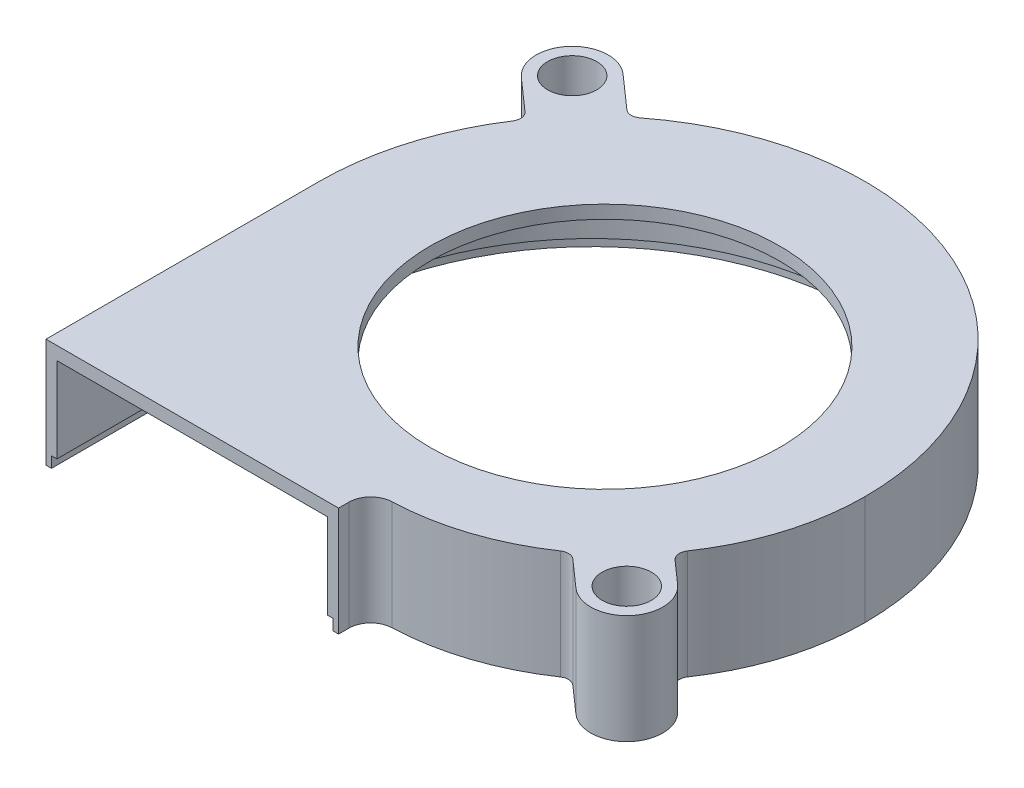
ISO-10303-21;
HEADER;
FILE_DESCRIPTION(('STEP AP214'),'2;1');
FILE_NAME('part.step','',(''),(''),'','','');
FILE_SCHEMA(('AUTOMOTIVE_DESIGN { 1 0 10303 214 1 1 1 1 }'));
ENDSEC;
DATA;
#1=APPLICATION_CONTEXT('core data for automotive mechanical design processes');
#2=APPLICATION_PROTOCOL_DEFINITION('international standard','automotive_design',2000,#1);
#3=PRODUCT_CONTEXT('',#1,'mechanical');
#4=PRODUCT('Part','Part','',(#3));
#5=PRODUCT_RELATED_PRODUCT_CATEGORY('part','',(#4));
#6=PRODUCT_DEFINITION_FORMATION('','',#4);
#7=PRODUCT_DEFINITION_CONTEXT('part definition',#1,'design');
#8=PRODUCT_DEFINITION('design','',#6,#7);
#9=PRODUCT_DEFINITION_SHAPE('','',#8);
#10=(LENGTH_UNIT() NAMED_UNIT(*) SI_UNIT(.MILLI.,.METRE.));
#11=(NAMED_UNIT(*) PLANE_ANGLE_UNIT() SI_UNIT($,.RADIAN.));
#12=(NAMED_UNIT(*) SI_UNIT($,.STERADIAN.) SOLID_ANGLE_UNIT());
#13=UNCERTAINTY_MEASURE_WITH_UNIT(LENGTH_MEASURE(1.E-05),#10,'distance_accuracy_value','');
#14=(GEOMETRIC_REPRESENTATION_CONTEXT(3) GLOBAL_UNCERTAINTY_ASSIGNED_CONTEXT((#13)) GLOBAL_UNIT_ASSIGNED_CONTEXT((#10,
#11,#12)) REPRESENTATION_CONTEXT('',''));
#15=CARTESIAN_POINT('',(0.,0.,0.));
#16=DIRECTION('',(0.,0.,1.));
#17=DIRECTION('',(1.,0.,0.));
#18=AXIS2_PLACEMENT_3D('',#15,#16,#17);
#19=CARTESIAN_POINT('',(-0.400000000000001,68.6136141093536,25.));
#20=DIRECTION('',(1.,0.,0.));
#21=DIRECTION('',(0.,0.,-1.));
#22=AXIS2_PLACEMENT_3D('',#19,#20,#21);
#23=PLANE('',#22);
#24=DIRECTION('',(0.,0.,-1.));
#25=VECTOR('',#24,1.);
#26=CARTESIAN_POINT('',(-0.400000000000001,-9.,24.0524077657047));
#27=LINE('',#26,#25);
#28=CARTESIAN_POINT('',(-0.400000000000001,-9.,25.));
#29=VERTEX_POINT('',#28);
#30=CARTESIAN_POINT('',(-0.400000000000001,-9.,24.0524077657047));
#31=VERTEX_POINT('',#30);
#32=EDGE_CURVE('E605',#29,#31,#27,.T.);
#33=ORIENTED_EDGE('',*,*,#32,.F.);
#34=DIRECTION('',(0.,-1.,0.));
#35=VECTOR('',#34,1.);
#36=CARTESIAN_POINT('',(-0.400000000000001,68.6136141093536,25.));
#37=LINE('',#36,#35);
#38=CARTESIAN_POINT('',(-0.400000000000001,-1.20000000000001,25.));
#39=VERTEX_POINT('',#38);
#40=EDGE_CURVE('E561',#39,#29,#37,.T.);
#41=ORIENTED_EDGE('',*,*,#40,.F.);
#42=DIRECTION('',(0.,0.,-1.));
#43=VECTOR('',#42,1.);
#44=CARTESIAN_POINT('',(-0.400000000000001,-1.20000000000001,25.));
#45=LINE('',#44,#43);
#46=CARTESIAN_POINT('',(-0.4,-1.20000000000001,24.0524077657047));
#47=VERTEX_POINT('',#46);
#48=EDGE_CURVE('E588',#39,#47,#45,.T.);
#49=ORIENTED_EDGE('',*,*,#48,.T.);
#50=DIRECTION('',(0.,-1.,0.));
#51=VECTOR('',#50,1.);
#52=CARTESIAN_POINT('',(-0.400000000000001,68.6136141093536,24.0524077657047));
#53=LINE('',#52,#51);
#54=EDGE_CURVE('E568',#47,#31,#53,.T.);
#55=ORIENTED_EDGE('',*,*,#54,.T.);
#56=EDGE_LOOP('',(#33,#41,#49,#55));
#57=FACE_BOUND('',#56,.T.);
#58=ADVANCED_FACE('F41',(#57),#23,.F.);
#59=CARTESIAN_POINT('',(2.6,68.6136141093536,24.0524077657047));
#60=DIRECTION('',(0.,-1.,0.));
#61=DIRECTION('',(0.,0.,-1.));
#62=AXIS2_PLACEMENT_3D('',#59,#60,#61);
#63=CYLINDRICAL_SURFACE('',#62,3.);
#64=CARTESIAN_POINT('',(2.6,-9.,24.0524077657047));
#65=DIRECTION('',(0.,-1.,0.));
#66=DIRECTION('',(0.,0.,-1.));
#67=AXIS2_PLACEMENT_3D('',#64,#65,#66);
#68=CIRCLE('',#67,3.);
#69=CARTESIAN_POINT('',(2.49179847072378,-9.,21.0543596625112));
#70=VERTEX_POINT('',#69);
#71=EDGE_CURVE('E624',#31,#70,#68,.T.);
#72=ORIENTED_EDGE('',*,*,#71,.F.);
#73=ORIENTED_EDGE('',*,*,#54,.F.);
#74=CARTESIAN_POINT('',(2.6,-1.20000000000001,24.0524077657047));
#75=DIRECTION('',(0.,-1.,0.));
#76=DIRECTION('',(0.,0.,-1.));
#77=AXIS2_PLACEMENT_3D('',#74,#75,#76);
#78=CIRCLE('',#77,3.);
#79=CARTESIAN_POINT('',(2.49179847072379,-1.20000000000001,21.0543596625112));
#80=VERTEX_POINT('',#79);
#81=EDGE_CURVE('E551',#47,#80,#78,.T.);
#82=ORIENTED_EDGE('',*,*,#81,.T.);
#83=DIRECTION('',(0.,-1.,0.));
#84=VECTOR('',#83,1.);
#85=CARTESIAN_POINT('',(2.49179847072379,68.6136141093536,21.0543596625112));
#86=LINE('',#85,#84);
#87=EDGE_CURVE('E547',#80,#70,#86,.T.);
#88=ORIENTED_EDGE('',*,*,#87,.T.);
#89=EDGE_LOOP('',(#72,#73,#82,#88));
#90=FACE_BOUND('',#89,.T.);
#91=ADVANCED_FACE('F350',(#90),#63,.T.);
#92=CARTESIAN_POINT('',(1.73193277310925,68.6136141093536,0.));
#93=DIRECTION('',(0.,-1.,0.));
#94=DIRECTION('',(0.,0.,-1.));
#95=AXIS2_PLACEMENT_3D('',#92,#93,#94);
#96=CYLINDRICAL_SURFACE('',#95,21.0680672268908);
#97=CARTESIAN_POINT('',(1.73193277310925,-9.,0.));
#98=DIRECTION('',(0.,1.,0.));
#99=DIRECTION('',(0.,0.,-1.));
#100=AXIS2_PLACEMENT_3D('',#97,#98,#99);
#101=CIRCLE('',#100,21.0680672268908);
#102=CARTESIAN_POINT('',(22.7999999921479,-9.,-0.000575200445968103));
#103=VERTEX_POINT('',#102);
#104=EDGE_CURVE('E677',#70,#103,#101,.T.);
#105=ORIENTED_EDGE('',*,*,#104,.F.);
#106=ORIENTED_EDGE('',*,*,#87,.F.);
#107=CARTESIAN_POINT('',(1.73193277310925,-1.20000000000001,0.));
#108=DIRECTION('',(0.,-1.,0.));
#109=DIRECTION('',(0.,0.,-1.));
#110=AXIS2_PLACEMENT_3D('',#107,#108,#109);
#111=CIRCLE('',#110,21.0680672268908);
#112=CARTESIAN_POINT('',(22.7999999921479,-1.20000000000001,-0.000575200445980473));
#113=VERTEX_POINT('',#112);
#114=EDGE_CURVE('E541',#80,#113,#111,.F.);
#115=ORIENTED_EDGE('',*,*,#114,.T.);
#116=DIRECTION('',(0.,-1.,0.));
#117=VECTOR('',#116,1.);
#118=CARTESIAN_POINT('',(22.7999999921479,68.6136141093536,-0.000575200445980471));
#119=LINE('',#118,#117);
#120=EDGE_CURVE('E545',#113,#103,#119,.T.);
#121=ORIENTED_EDGE('',*,*,#120,.T.);
#122=EDGE_LOOP('',(#105,#106,#115,#121));
#123=FACE_BOUND('',#122,.T.);
#124=ADVANCED_FACE('F356',(#123),#96,.F.);
#125=CARTESIAN_POINT('',(-1.2,68.6136141093536,-0.0288000000000007));
#126=DIRECTION('',(0.,-1.,0.));
#127=DIRECTION('',(0.,0.,-1.));
#128=AXIS2_PLACEMENT_3D('',#125,#126,#127);
#129=CYLINDRICAL_SURFACE('',#128,24.0000165887945);
#130=CARTESIAN_POINT('',(-1.2,-9.,-0.0288000000000007));
#131=DIRECTION('',(0.,1.,0.));
#132=DIRECTION('',(0.,0.,-1.));
#133=AXIS2_PLACEMENT_3D('',#130,#131,#132);
#134=CIRCLE('',#133,24.0000165887945);
#135=CARTESIAN_POINT('',(-25.2,-9.00000000000001,-0.000581877966769429));
#136=VERTEX_POINT('',#135);
#137=EDGE_CURVE('E59',#103,#136,#134,.T.);
#138=ORIENTED_EDGE('',*,*,#137,.F.);
#139=ORIENTED_EDGE('',*,*,#120,.F.);
#140=CARTESIAN_POINT('',(-1.2,-1.20000000000001,-0.0288000000000007));
#141=DIRECTION('',(0.,-1.,0.));
#142=DIRECTION('',(0.,0.,-1.));
#143=AXIS2_PLACEMENT_3D('',#140,#141,#142);
#144=CIRCLE('',#143,24.0000165887945);
#145=CARTESIAN_POINT('',(-25.2,-1.20000000000001,-0.000581877966769429));
#146=VERTEX_POINT('',#145);
#147=EDGE_CURVE('E552',#113,#146,#144,.F.);
#148=ORIENTED_EDGE('',*,*,#147,.T.);
#149=DIRECTION('',(0.,-1.,0.));
#150=VECTOR('',#149,1.);
#151=CARTESIAN_POINT('',(-25.2,68.6136141093536,-0.000581877966769429));
#152=LINE('',#151,#150);
#153=EDGE_CURVE('E564',#146,#136,#152,.T.);
#154=ORIENTED_EDGE('',*,*,#153,.T.);
#155=EDGE_LOOP('',(#138,#139,#148,#154));
#156=FACE_BOUND('',#155,.T.);
#157=ADVANCED_FACE('F366',(#156),#129,.F.);
#158=CARTESIAN_POINT('',(-25.2,68.6136141093536,-0.000581877966782148));
#159=DIRECTION('',(-1.,0.,0.));
#160=DIRECTION('',(0.,0.,1.));
#161=AXIS2_PLACEMENT_3D('',#158,#159,#160);
#162=PLANE('',#161);
#163=DIRECTION('',(0.,0.,1.));
#164=VECTOR('',#163,1.);
#165=CARTESIAN_POINT('',(-25.2,-9.,25.));
#166=LINE('',#165,#164);
#167=CARTESIAN_POINT('',(-25.2,-9.,25.));
#168=VERTEX_POINT('',#167);
#169=EDGE_CURVE('E672',#136,#168,#166,.T.);
#170=ORIENTED_EDGE('',*,*,#169,.F.);
#171=ORIENTED_EDGE('',*,*,#153,.F.);
#172=DIRECTION('',(0.,0.,1.));
#173=VECTOR('',#172,1.);
#174=CARTESIAN_POINT('',(-25.2,-1.20000000000001,-0.000581877966782148));
#175=LINE('',#174,#173);
#176=CARTESIAN_POINT('',(-25.2,-1.20000000000001,25.));
#177=VERTEX_POINT('',#176);
#178=EDGE_CURVE('E557',#146,#177,#175,.T.);
#179=ORIENTED_EDGE('',*,*,#178,.T.);
#180=DIRECTION('',(0.,-1.,0.));
#181=VECTOR('',#180,1.);
#182=CARTESIAN_POINT('',(-25.2,68.6136141093536,25.));
#183=LINE('',#182,#181);
#184=EDGE_CURVE('E570',#177,#168,#183,.T.);
#185=ORIENTED_EDGE('',*,*,#184,.T.);
#186=EDGE_LOOP('',(#170,#171,#179,#185));
#187=FACE_BOUND('',#186,.T.);
#188=ADVANCED_FACE('F370',(#187),#162,.F.);
#189=CARTESIAN_POINT('',(0.,-10.,0.));
#190=DIRECTION('',(0.,1.,0.));
#191=DIRECTION('',(0.,0.,1.));
#192=AXIS2_PLACEMENT_3D('',#189,#190,#191);
#193=CYLINDRICAL_SURFACE('',#192,16.);
#194=CARTESIAN_POINT('',(0.,0.,0.));
#195=DIRECTION('',(0.,1.,0.));
#196=DIRECTION('',(0.,0.,1.));
#197=AXIS2_PLACEMENT_3D('',#194,#195,#196);
#198=CIRCLE('',#197,16.);
#199=CARTESIAN_POINT('',(0.,0.,16.));
#200=VERTEX_POINT('',#199);
#201=EDGE_CURVE('E394',#200,#200,#198,.T.);
#202=ORIENTED_EDGE('',*,*,#201,.T.);
#203=EDGE_LOOP('',(#202));
#204=FACE_BOUND('',#203,.T.);
#205=CARTESIAN_POINT('',(0.,-1.2,0.));
#206=DIRECTION('',(0.,-1.,0.));
#207=DIRECTION('',(0.,0.,-1.));
#208=AXIS2_PLACEMENT_3D('',#205,#206,#207);
#209=CIRCLE('',#208,16.);
#210=CARTESIAN_POINT('',(0.,-1.2,-16.));
#211=VERTEX_POINT('',#210);
#212=EDGE_CURVE('E45',#211,#211,#209,.F.);
#213=ORIENTED_EDGE('',*,*,#212,.F.);
#214=EDGE_LOOP('',(#213));
#215=FACE_BOUND('',#214,.T.);
#216=ADVANCED_FACE('F347',(#204,#215),#193,.F.);
#217=CARTESIAN_POINT('',(-23.,-10.,-20.));
#218=DIRECTION('',(0.,1.,0.));
#219=DIRECTION('',(0.,0.,1.));
#220=AXIS2_PLACEMENT_3D('',#217,#218,#219);
#221=CYLINDRICAL_SURFACE('',#220,3.3);
#222=CARTESIAN_POINT('',(-23.,0.,-20.));
#223=DIRECTION('',(0.,1.,0.));
#224=DIRECTION('',(0.,0.,-1.));
#225=AXIS2_PLACEMENT_3D('',#222,#223,#224);
#226=CIRCLE('',#225,3.3);
#227=CARTESIAN_POINT('',(-20.8147472716434,0.,-22.4727859820878));
#228=VERTEX_POINT('',#227);
#229=CARTESIAN_POINT('',(-25.1852527283566,0.,-17.5272140179122));
#230=VERTEX_POINT('',#229);
#231=EDGE_CURVE('E221',#228,#230,#226,.T.);
#232=ORIENTED_EDGE('',*,*,#231,.F.);
#233=DIRECTION('',(0.,1.,0.));
#234=VECTOR('',#233,1.);
#235=CARTESIAN_POINT('',(-20.8147472716434,-10.,-22.4727859820878));
#236=LINE('',#235,#234);
#237=CARTESIAN_POINT('',(-20.8147472716434,-10.,-22.4727859820878));
#238=VERTEX_POINT('',#237);
#239=EDGE_CURVE('E12',#238,#228,#236,.T.);
#240=ORIENTED_EDGE('',*,*,#239,.F.);
#241=CARTESIAN_POINT('',(-23.,-10.,-20.));
#242=DIRECTION('',(0.,1.,0.));
#243=DIRECTION('',(0.,0.,-1.));
#244=AXIS2_PLACEMENT_3D('',#241,#242,#243);
#245=CIRCLE('',#244,3.3);
#246=CARTESIAN_POINT('',(-25.1852527283566,-10.,-17.5272140179122));
#247=VERTEX_POINT('',#246);
#248=EDGE_CURVE('E290',#238,#247,#245,.T.);
#249=ORIENTED_EDGE('',*,*,#248,.T.);
#250=DIRECTION('',(0.,1.,0.));
#251=VECTOR('',#250,1.);
#252=CARTESIAN_POINT('',(-25.1852527283566,-10.,-17.5272140179122));
#253=LINE('',#252,#251);
#254=EDGE_CURVE('E135',#247,#230,#253,.T.);
#255=ORIENTED_EDGE('',*,*,#254,.T.);
#256=EDGE_LOOP('',(#232,#240,#249,#255));
#257=FACE_BOUND('',#256,.T.);
#258=ADVANCED_FACE('F43',(#257),#221,.T.);
#259=CARTESIAN_POINT('',(-20.8147472716434,-10.,-22.4727859820878));
#260=DIRECTION('',(0.66219779647171,0.,-0.749329085481147));
#261=DIRECTION('',(-0.749329085481147,0.,-0.66219779647171));
#262=AXIS2_PLACEMENT_3D('',#259,#260,#261);
#263=PLANE('',#262);
#264=DIRECTION('',(-0.749329085481147,0.,-0.66219779647171));
#265=VECTOR('',#264,1.);
#266=CARTESIAN_POINT('',(-20.8147472716434,0.,-22.4727859820878));
#267=LINE('',#266,#265);
#268=CARTESIAN_POINT('',(-17.807958534947,0.,-19.8156238426817));
#269=VERTEX_POINT('',#268);
#270=EDGE_CURVE('E287',#269,#228,#267,.T.);
#271=ORIENTED_EDGE('',*,*,#270,.F.);
#272=DIRECTION('',(0.,1.,0.));
#273=VECTOR('',#272,1.);
#274=CARTESIAN_POINT('',(-17.807958534947,-10.,-19.8156238426817));
#275=LINE('',#274,#273);
#276=CARTESIAN_POINT('',(-17.807958534947,-10.,-19.8156238426817));
#277=VERTEX_POINT('',#276);
#278=EDGE_CURVE('E51',#277,#269,#275,.T.);
#279=ORIENTED_EDGE('',*,*,#278,.F.);
#280=DIRECTION('',(-0.749329085481147,0.,-0.66219779647171));
#281=VECTOR('',#280,1.);
#282=CARTESIAN_POINT('',(-20.8147472716434,-10.,-22.4727859820878));
#283=LINE('',#282,#281);
#284=EDGE_CURVE('E207',#277,#238,#283,.T.);
#285=ORIENTED_EDGE('',*,*,#284,.T.);
#286=ORIENTED_EDGE('',*,*,#239,.T.);
#287=EDGE_LOOP('',(#271,#279,#285,#286));
#288=FACE_BOUND('',#287,.T.);
#289=ADVANCED_FACE('F339',(#288),#263,.T.);
#290=CARTESIAN_POINT('',(-17.1457607384752,-10.,-20.5649529281628));
#291=DIRECTION('',(0.,1.,0.));
#292=DIRECTION('',(0.,0.,1.));
#293=AXIS2_PLACEMENT_3D('',#290,#291,#292);
#294=CYLINDRICAL_SURFACE('',#293,1.);
#295=CARTESIAN_POINT('',(-17.1457607384752,0.,-20.5649529281628));
#296=DIRECTION('',(0.,-1.,0.));
#297=DIRECTION('',(0.,0.,1.));
#298=AXIS2_PLACEMENT_3D('',#295,#296,#297);
#299=CIRCLE('',#298,1.);
#300=CARTESIAN_POINT('',(-16.5324626398368,0.,-19.7751013964137));
#301=VERTEX_POINT('',#300);
#302=EDGE_CURVE('E191',#301,#269,#299,.T.);
#303=ORIENTED_EDGE('',*,*,#302,.F.);
#304=DIRECTION('',(0.,1.,0.));
#305=VECTOR('',#304,1.);
#306=CARTESIAN_POINT('',(-16.5324626398368,-10.,-19.7751013964137));
#307=LINE('',#306,#305);
#308=CARTESIAN_POINT('',(-16.5324626398368,-10.,-19.7751013964137));
#309=VERTEX_POINT('',#308);
#310=EDGE_CURVE('E185',#309,#301,#307,.T.);
#311=ORIENTED_EDGE('',*,*,#310,.F.);
#312=CARTESIAN_POINT('',(-17.1457607384752,-10.,-20.5649529281628));
#313=DIRECTION('',(0.,-1.,0.));
#314=DIRECTION('',(0.,0.,1.));
#315=AXIS2_PLACEMENT_3D('',#312,#313,#314);
#316=CIRCLE('',#315,1.);
#317=EDGE_CURVE('E188',#309,#277,#316,.T.);
#318=ORIENTED_EDGE('',*,*,#317,.T.);
#319=ORIENTED_EDGE('',*,*,#278,.T.);
#320=EDGE_LOOP('',(#303,#311,#318,#319));
#321=FACE_BOUND('',#320,.T.);
#322=ADVANCED_FACE('F187',(#321),#294,.F.);
#323=CARTESIAN_POINT('',(-1.2,-10.,-0.0288000000000007));
#324=DIRECTION('',(0.,1.,0.));
#325=DIRECTION('',(0.,0.,1.));
#326=AXIS2_PLACEMENT_3D('',#323,#324,#325);
#327=CYLINDRICAL_SURFACE('',#326,25.0000165887945);
#328=CARTESIAN_POINT('',(-1.2,0.,-0.0288000000000007));
#329=DIRECTION('',(0.,1.,0.));
#330=DIRECTION('',(0.,0.,1.));
#331=AXIS2_PLACEMENT_3D('',#328,#329,#330);
#332=CIRCLE('',#331,25.0000165887945);
#333=CARTESIAN_POINT('',(23.8,0.,0.));
#334=VERTEX_POINT('',#333);
#335=EDGE_CURVE('E282',#334,#301,#332,.T.);
#336=ORIENTED_EDGE('',*,*,#335,.F.);
#337=DIRECTION('',(0.,1.,0.));
#338=VECTOR('',#337,1.);
#339=CARTESIAN_POINT('',(23.8,-10.,0.));
#340=LINE('',#339,#338);
#341=CARTESIAN_POINT('',(23.8,-10.,0.));
#342=VERTEX_POINT('',#341);
#343=EDGE_CURVE('E197',#342,#334,#340,.T.);
#344=ORIENTED_EDGE('',*,*,#343,.F.);
#345=CARTESIAN_POINT('',(-1.2,-10.,-0.0288000000000007));
#346=DIRECTION('',(0.,1.,0.));
#347=DIRECTION('',(0.,0.,1.));
#348=AXIS2_PLACEMENT_3D('',#345,#346,#347);
#349=CIRCLE('',#348,25.0000165887945);
#350=EDGE_CURVE('E205',#342,#309,#349,.T.);
#351=ORIENTED_EDGE('',*,*,#350,.T.);
#352=ORIENTED_EDGE('',*,*,#310,.T.);
#353=EDGE_LOOP('',(#336,#344,#351,#352));
#354=FACE_BOUND('',#353,.T.);
#355=ADVANCED_FACE('F210',(#354),#327,.T.);
#356=CARTESIAN_POINT('',(1.73193277310925,-10.,0.));
#357=DIRECTION('',(0.,1.,0.));
#358=DIRECTION('',(0.,0.,1.));
#359=AXIS2_PLACEMENT_3D('',#356,#357,#358);
#360=CYLINDRICAL_SURFACE('',#359,22.0680672268908);
#361=CARTESIAN_POINT('',(1.73193277310925,0.,0.));
#362=DIRECTION('',(0.,1.,0.));
#363=DIRECTION('',(0.,0.,-1.));
#364=AXIS2_PLACEMENT_3D('',#361,#362,#363);
#365=CIRCLE('',#364,22.0680672268908);
#366=CARTESIAN_POINT('',(19.9790752063348,0.,12.4113409489929));
#367=VERTEX_POINT('',#366);
#368=EDGE_CURVE('E278',#367,#334,#365,.T.);
#369=ORIENTED_EDGE('',*,*,#368,.F.);
#370=DIRECTION('',(0.,1.,0.));
#371=VECTOR('',#370,1.);
#372=CARTESIAN_POINT('',(19.9790752063348,-10.,12.4113409489929));
#373=LINE('',#372,#371);
#374=CARTESIAN_POINT('',(19.9790752063348,-10.,12.4113409489929));
#375=VERTEX_POINT('',#374);
#376=EDGE_CURVE('E296',#375,#367,#373,.T.);
#377=ORIENTED_EDGE('',*,*,#376,.F.);
#378=CARTESIAN_POINT('',(1.73193277310925,-10.,0.));
#379=DIRECTION('',(0.,1.,0.));
#380=DIRECTION('',(0.,0.,-1.));
#381=AXIS2_PLACEMENT_3D('',#378,#379,#380);
#382=CIRCLE('',#381,22.0680672268908);
#383=EDGE_CURVE('E212',#375,#342,#382,.T.);
#384=ORIENTED_EDGE('',*,*,#383,.T.);
#385=ORIENTED_EDGE('',*,*,#343,.T.);
#386=EDGE_LOOP('',(#369,#377,#384,#385));
#387=FACE_BOUND('',#386,.T.);
#388=ADVANCED_FACE('F743',(#387),#360,.T.);
#389=CARTESIAN_POINT('',(20.8059325040591,-10.,12.9737527280304));
#390=DIRECTION('',(0.,1.,0.));
#391=DIRECTION('',(0.,0.,1.));
#392=AXIS2_PLACEMENT_3D('',#389,#390,#391);
#393=CYLINDRICAL_SURFACE('',#392,1.);
#394=CARTESIAN_POINT('',(20.8059325040591,0.,12.9737527280304));
#395=DIRECTION('',(0.,-1.,0.));
#396=DIRECTION('',(0.,0.,-1.));
#397=AXIS2_PLACEMENT_3D('',#394,#395,#396);
#398=CIRCLE('',#397,1.);
#399=CARTESIAN_POINT('',(20.1437347075874,0.,13.7230818135115));
#400=VERTEX_POINT('',#399);
#401=EDGE_CURVE('E274',#400,#367,#398,.T.);
#402=ORIENTED_EDGE('',*,*,#401,.F.);
#403=DIRECTION('',(0.,1.,0.));
#404=VECTOR('',#403,1.);
#405=CARTESIAN_POINT('',(20.1437347075874,-10.,13.7230818135115));
#406=LINE('',#405,#404);
#407=CARTESIAN_POINT('',(20.1437347075874,-10.,13.7230818135115));
#408=VERTEX_POINT('',#407);
#409=EDGE_CURVE('E299',#408,#400,#406,.T.);
#410=ORIENTED_EDGE('',*,*,#409,.F.);
#411=CARTESIAN_POINT('',(20.8059325040591,-10.,12.9737527280304));
#412=DIRECTION('',(0.,-1.,0.));
#413=DIRECTION('',(0.,0.,-1.));
#414=AXIS2_PLACEMENT_3D('',#411,#412,#413);
#415=CIRCLE('',#414,1.);
#416=EDGE_CURVE('E215',#408,#375,#415,.T.);
#417=ORIENTED_EDGE('',*,*,#416,.T.);
#418=ORIENTED_EDGE('',*,*,#376,.T.);
#419=EDGE_LOOP('',(#402,#410,#417,#418));
#420=FACE_BOUND('',#419,.T.);
#421=ADVANCED_FACE('F468',(#420),#393,.F.);
#422=CARTESIAN_POINT('',(22.1852527283566,-10.,15.5272140179122));
#423=DIRECTION('',(0.66219779647171,0.,-0.749329085481147));
#424=DIRECTION('',(-0.749329085481147,0.,-0.66219779647171));
#425=AXIS2_PLACEMENT_3D('',#422,#423,#424);
#426=PLANE('',#425);
#427=DIRECTION('',(-0.749329085481146,0.,-0.66219779647171));
#428=VECTOR('',#427,1.);
#429=CARTESIAN_POINT('',(22.1852527283566,0.,15.5272140179122));
#430=LINE('',#429,#428);
#431=CARTESIAN_POINT('',(22.1852527283566,0.,15.5272140179122));
#432=VERTEX_POINT('',#431);
#433=EDGE_CURVE('E270',#432,#400,#430,.T.);
#434=ORIENTED_EDGE('',*,*,#433,.F.);
#435=DIRECTION('',(0.,1.,0.));
#436=VECTOR('',#435,1.);
#437=CARTESIAN_POINT('',(22.1852527283566,-10.,15.5272140179122));
#438=LINE('',#437,#436);
#439=CARTESIAN_POINT('',(22.1852527283566,-10.,15.5272140179122));
#440=VERTEX_POINT('',#439);
#441=EDGE_CURVE('E302',#440,#432,#438,.T.);
#442=ORIENTED_EDGE('',*,*,#441,.F.);
#443=DIRECTION('',(-0.749329085481146,0.,-0.66219779647171));
#444=VECTOR('',#443,1.);
#445=CARTESIAN_POINT('',(22.1852527283566,-10.,15.5272140179122));
#446=LINE('',#445,#444);
#447=EDGE_CURVE('E460',#440,#408,#446,.T.);
#448=ORIENTED_EDGE('',*,*,#447,.T.);
#449=ORIENTED_EDGE('',*,*,#409,.T.);
#450=EDGE_LOOP('',(#434,#442,#448,#449));
#451=FACE_BOUND('',#450,.T.);
#452=ADVANCED_FACE('F474',(#451),#426,.T.);
#453=CARTESIAN_POINT('',(20.,-10.,18.));
#454=DIRECTION('',(0.,1.,0.));
#455=DIRECTION('',(0.,0.,1.));
#456=AXIS2_PLACEMENT_3D('',#453,#454,#455);
#457=CYLINDRICAL_SURFACE('',#456,3.3);
#458=CARTESIAN_POINT('',(20.,0.,18.));
#459=DIRECTION('',(0.,1.,0.));
#460=DIRECTION('',(0.,0.,-1.));
#461=AXIS2_PLACEMENT_3D('',#458,#459,#460);
#462=CIRCLE('',#461,3.3);
#463=CARTESIAN_POINT('',(17.8147472716434,0.,20.4727859820878));
#464=VERTEX_POINT('',#463);
#465=EDGE_CURVE('E266',#464,#432,#462,.T.);
#466=ORIENTED_EDGE('',*,*,#465,.F.);
#467=DIRECTION('',(0.,1.,0.));
#468=VECTOR('',#467,1.);
#469=CARTESIAN_POINT('',(17.8147472716434,-10.,20.4727859820878));
#470=LINE('',#469,#468);
#471=CARTESIAN_POINT('',(17.8147472716434,-10.,20.4727859820878));
#472=VERTEX_POINT('',#471);
#473=EDGE_CURVE('E305',#472,#464,#470,.T.);
#474=ORIENTED_EDGE('',*,*,#473,.F.);
#475=CARTESIAN_POINT('',(20.,-10.,18.));
#476=DIRECTION('',(0.,1.,0.));
#477=DIRECTION('',(0.,0.,-1.));
#478=AXIS2_PLACEMENT_3D('',#475,#476,#477);
#479=CIRCLE('',#478,3.3);
#480=EDGE_CURVE('E456',#472,#440,#479,.T.);
#481=ORIENTED_EDGE('',*,*,#480,.T.);
#482=ORIENTED_EDGE('',*,*,#441,.T.);
#483=EDGE_LOOP('',(#466,#474,#481,#482));
#484=FACE_BOUND('',#483,.T.);
#485=ADVANCED_FACE('F477',(#484),#457,.T.);
#486=CARTESIAN_POINT('',(17.8147472716434,-10.,20.4727859820878));
#487=DIRECTION('',(-0.66219779647171,0.,0.749329085481146));
#488=DIRECTION('',(0.749329085481146,0.,0.66219779647171));
#489=AXIS2_PLACEMENT_3D('',#486,#487,#488);
#490=PLANE('',#489);
#491=DIRECTION('',(0.749329085481146,0.,0.66219779647171));
#492=VECTOR('',#491,1.);
#493=CARTESIAN_POINT('',(17.8147472716434,0.,20.4727859820878));
#494=LINE('',#493,#492);
#495=CARTESIAN_POINT('',(15.3769800356374,0.,18.3184800525942));
#496=VERTEX_POINT('',#495);
#497=EDGE_CURVE('E262',#496,#464,#494,.T.);
#498=ORIENTED_EDGE('',*,*,#497,.F.);
#499=DIRECTION('',(0.,1.,0.));
#500=VECTOR('',#499,1.);
#501=CARTESIAN_POINT('',(15.3769800356374,-10.,18.3184800525942));
#502=LINE('',#501,#500);
#503=CARTESIAN_POINT('',(15.3769800356374,-10.,18.3184800525942));
#504=VERTEX_POINT('',#503);
#505=EDGE_CURVE('E308',#504,#496,#502,.T.);
#506=ORIENTED_EDGE('',*,*,#505,.F.);
#507=DIRECTION('',(0.749329085481146,0.,0.66219779647171));
#508=VECTOR('',#507,1.);
#509=CARTESIAN_POINT('',(17.8147472716434,-10.,20.4727859820878));
#510=LINE('',#509,#508);
#511=EDGE_CURVE('E452',#504,#472,#510,.T.);
#512=ORIENTED_EDGE('',*,*,#511,.T.);
#513=ORIENTED_EDGE('',*,*,#473,.T.);
#514=EDGE_LOOP('',(#498,#506,#512,#513));
#515=FACE_BOUND('',#514,.T.);
#516=ADVANCED_FACE('F482',(#515),#490,.T.);
#517=CARTESIAN_POINT('',(14.7147822391657,-10.,19.0678091380753));
#518=DIRECTION('',(0.,1.,0.));
#519=DIRECTION('',(0.,0.,1.));
#520=AXIS2_PLACEMENT_3D('',#517,#518,#519);
#521=CYLINDRICAL_SURFACE('',#520,1.);
#522=CARTESIAN_POINT('',(14.7147822391657,0.,19.0678091380753));
#523=DIRECTION('',(0.,-1.,0.));
#524=DIRECTION('',(0.,0.,1.));
#525=AXIS2_PLACEMENT_3D('',#522,#523,#524);
#526=CIRCLE('',#525,1.);
#527=CARTESIAN_POINT('',(14.1519761168165,0.,18.2412202023604));
#528=VERTEX_POINT('',#527);
#529=EDGE_CURVE('E258',#528,#496,#526,.T.);
#530=ORIENTED_EDGE('',*,*,#529,.F.);
#531=DIRECTION('',(0.,1.,0.));
#532=VECTOR('',#531,1.);
#533=CARTESIAN_POINT('',(14.1519761168165,-10.,18.2412202023604));
#534=LINE('',#533,#532);
#535=CARTESIAN_POINT('',(14.1519761168165,-10.,18.2412202023604));
#536=VERTEX_POINT('',#535);
#537=EDGE_CURVE('E311',#536,#528,#534,.T.);
#538=ORIENTED_EDGE('',*,*,#537,.F.);
#539=CARTESIAN_POINT('',(14.7147822391657,-10.,19.0678091380753));
#540=DIRECTION('',(0.,-1.,0.));
#541=DIRECTION('',(0.,0.,1.));
#542=AXIS2_PLACEMENT_3D('',#539,#540,#541);
#543=CIRCLE('',#542,1.);
#544=EDGE_CURVE('E448',#536,#504,#543,.T.);
#545=ORIENTED_EDGE('',*,*,#544,.T.);
#546=ORIENTED_EDGE('',*,*,#505,.T.);
#547=EDGE_LOOP('',(#530,#538,#545,#546));
#548=FACE_BOUND('',#547,.T.);
#549=ADVANCED_FACE('F485',(#548),#521,.F.);
#550=CARTESIAN_POINT('',(1.73193277310925,-10.,0.));
#551=DIRECTION('',(0.,1.,0.));
#552=DIRECTION('',(0.,0.,1.));
#553=AXIS2_PLACEMENT_3D('',#550,#551,#552);
#554=CYLINDRICAL_SURFACE('',#553,22.0680672268908);
#555=CARTESIAN_POINT('',(1.73193277310925,0.,0.));
#556=DIRECTION('',(0.,1.,0.));
#557=DIRECTION('',(0.,0.,-1.));
#558=AXIS2_PLACEMENT_3D('',#555,#556,#557);
#559=CIRCLE('',#558,22.0680672268908);
#560=CARTESIAN_POINT('',(2.52786564714919,0.,22.0537090302423));
#561=VERTEX_POINT('',#560);
#562=EDGE_CURVE('E254',#561,#528,#559,.T.);
#563=ORIENTED_EDGE('',*,*,#562,.F.);
#564=DIRECTION('',(0.,1.,0.));
#565=VECTOR('',#564,1.);
#566=CARTESIAN_POINT('',(2.52786564714919,-10.,22.0537090302423));
#567=LINE('',#566,#565);
#568=CARTESIAN_POINT('',(2.52786564714919,-10.,22.0537090302423));
#569=VERTEX_POINT('',#568);
#570=EDGE_CURVE('E314',#569,#561,#567,.T.);
#571=ORIENTED_EDGE('',*,*,#570,.F.);
#572=CARTESIAN_POINT('',(1.73193277310925,-10.,0.));
#573=DIRECTION('',(0.,1.,0.));
#574=DIRECTION('',(0.,0.,-1.));
#575=AXIS2_PLACEMENT_3D('',#572,#573,#574);
#576=CIRCLE('',#575,22.0680672268908);
#577=EDGE_CURVE('E444',#569,#536,#576,.T.);
#578=ORIENTED_EDGE('',*,*,#577,.T.);
#579=ORIENTED_EDGE('',*,*,#537,.T.);
#580=EDGE_LOOP('',(#563,#571,#578,#579));
#581=FACE_BOUND('',#580,.T.);
#582=ADVANCED_FACE('F490',(#581),#554,.T.);
#583=CARTESIAN_POINT('',(2.6,-10.,24.0524077657047));
#584=DIRECTION('',(0.,1.,0.));
#585=DIRECTION('',(0.,0.,1.));
#586=AXIS2_PLACEMENT_3D('',#583,#584,#585);
#587=CYLINDRICAL_SURFACE('',#586,2.);
#588=CARTESIAN_POINT('',(2.6,0.,24.0524077657047));
#589=DIRECTION('',(0.,-1.,0.));
#590=DIRECTION('',(0.,0.,1.));
#591=AXIS2_PLACEMENT_3D('',#588,#589,#590);
#592=CIRCLE('',#591,2.);
#593=CARTESIAN_POINT('',(0.6,0.,24.0524077657047));
#594=VERTEX_POINT('',#593);
#595=EDGE_CURVE('E250',#594,#561,#592,.T.);
#596=ORIENTED_EDGE('',*,*,#595,.F.);
#597=DIRECTION('',(0.,1.,0.));
#598=VECTOR('',#597,1.);
#599=CARTESIAN_POINT('',(0.6,-10.,24.0524077657047));
#600=LINE('',#599,#598);
#601=CARTESIAN_POINT('',(0.6,-10.,24.0524077657047));
#602=VERTEX_POINT('',#601);
#603=EDGE_CURVE('E317',#602,#594,#600,.T.);
#604=ORIENTED_EDGE('',*,*,#603,.F.);
#605=CARTESIAN_POINT('',(2.6,-10.,24.0524077657047));
#606=DIRECTION('',(0.,-1.,0.));
#607=DIRECTION('',(0.,0.,1.));
#608=AXIS2_PLACEMENT_3D('',#605,#606,#607);
#609=CIRCLE('',#608,2.);
#610=EDGE_CURVE('E440',#602,#569,#609,.T.);
#611=ORIENTED_EDGE('',*,*,#610,.T.);
#612=ORIENTED_EDGE('',*,*,#570,.T.);
#613=EDGE_LOOP('',(#596,#604,#611,#612));
#614=FACE_BOUND('',#613,.T.);
#615=ADVANCED_FACE('F493',(#614),#587,.F.);
#616=CARTESIAN_POINT('',(0.6,-10.,25.));
#617=DIRECTION('',(1.,0.,0.));
#618=DIRECTION('',(0.,0.,-1.));
#619=AXIS2_PLACEMENT_3D('',#616,#617,#618);
#620=PLANE('',#619);
#621=DIRECTION('',(0.,0.,-1.));
#622=VECTOR('',#621,1.);
#623=CARTESIAN_POINT('',(0.6,0.,25.));
#624=LINE('',#623,#622);
#625=CARTESIAN_POINT('',(0.6,0.,25.));
#626=VERTEX_POINT('',#625);
#627=EDGE_CURVE('E246',#626,#594,#624,.T.);
#628=ORIENTED_EDGE('',*,*,#627,.F.);
#629=DIRECTION('',(0.,1.,0.));
#630=VECTOR('',#629,1.);
#631=CARTESIAN_POINT('',(0.6,-10.,25.));
#632=LINE('',#631,#630);
#633=CARTESIAN_POINT('',(0.6,-10.,25.));
#634=VERTEX_POINT('',#633);
#635=EDGE_CURVE('E320',#634,#626,#632,.T.);
#636=ORIENTED_EDGE('',*,*,#635,.F.);
#637=DIRECTION('',(0.,0.,-1.));
#638=VECTOR('',#637,1.);
#639=CARTESIAN_POINT('',(0.6,-10.,25.));
#640=LINE('',#639,#638);
#641=EDGE_CURVE('E436',#634,#602,#640,.T.);
#642=ORIENTED_EDGE('',*,*,#641,.T.);
#643=ORIENTED_EDGE('',*,*,#603,.T.);
#644=EDGE_LOOP('',(#628,#636,#642,#643));
#645=FACE_BOUND('',#644,.T.);
#646=ADVANCED_FACE('F499',(#645),#620,.T.);
#647=CARTESIAN_POINT('',(-26.2,-10.,25.));
#648=DIRECTION('',(0.,0.,1.));
#649=DIRECTION('',(1.,0.,0.));
#650=AXIS2_PLACEMENT_3D('',#647,#648,#649);
#651=PLANE('',#650);
#652=DIRECTION('',(0.,-1.,0.));
#653=VECTOR('',#652,1.);
#654=CARTESIAN_POINT('',(-25.7,-9.,25.));
#655=LINE('',#654,#653);
#656=CARTESIAN_POINT('',(-25.7,-9.,25.));
#657=VERTEX_POINT('',#656);
#658=CARTESIAN_POINT('',(-25.7,-10.,25.));
#659=VERTEX_POINT('',#658);
#660=EDGE_CURVE('E600',#657,#659,#655,.T.);
#661=ORIENTED_EDGE('',*,*,#660,.F.);
#662=DIRECTION('',(-1.,0.,0.));
#663=VECTOR('',#662,1.);
#664=CARTESIAN_POINT('',(-25.7,-9.,25.));
#665=LINE('',#664,#663);
#666=EDGE_CURVE('E668',#168,#657,#665,.T.);
#667=ORIENTED_EDGE('',*,*,#666,.F.);
#668=ORIENTED_EDGE('',*,*,#184,.F.);
#669=DIRECTION('',(1.,0.,0.));
#670=VECTOR('',#669,1.);
#671=CARTESIAN_POINT('',(-25.2,-1.20000000000001,25.));
#672=LINE('',#671,#670);
#673=EDGE_CURVE('E579',#177,#39,#672,.T.);
#674=ORIENTED_EDGE('',*,*,#673,.T.);
#675=ORIENTED_EDGE('',*,*,#40,.T.);
#676=DIRECTION('',(-1.,0.,0.));
#677=VECTOR('',#676,1.);
#678=CARTESIAN_POINT('',(-0.400000000000001,-9.,25.));
#679=LINE('',#678,#677);
#680=CARTESIAN_POINT('',(0.0999999999999994,-9.,25.));
#681=VERTEX_POINT('',#680);
#682=EDGE_CURVE('E644',#681,#29,#679,.T.);
#683=ORIENTED_EDGE('',*,*,#682,.F.);
#684=DIRECTION('',(0.,-1.,0.));
#685=VECTOR('',#684,1.);
#686=CARTESIAN_POINT('',(0.0999999999999994,-9.,25.));
#687=LINE('',#686,#685);
#688=CARTESIAN_POINT('',(0.0999999999999994,-10.,25.));
#689=VERTEX_POINT('',#688);
#690=EDGE_CURVE('E508',#681,#689,#687,.T.);
#691=ORIENTED_EDGE('',*,*,#690,.T.);
#692=DIRECTION('',(1.,0.,0.));
#693=VECTOR('',#692,1.);
#694=CARTESIAN_POINT('',(-26.2,-10.,25.));
#695=LINE('',#694,#693);
#696=EDGE_CURVE('E431',#689,#634,#695,.T.);
#697=ORIENTED_EDGE('',*,*,#696,.T.);
#698=ORIENTED_EDGE('',*,*,#635,.T.);
#699=DIRECTION('',(1.,0.,0.));
#700=VECTOR('',#699,1.);
#701=CARTESIAN_POINT('',(-26.2,0.,25.));
#702=LINE('',#701,#700);
#703=CARTESIAN_POINT('',(-26.2,0.,25.));
#704=VERTEX_POINT('',#703);
#705=EDGE_CURVE('E242',#704,#626,#702,.T.);
#706=ORIENTED_EDGE('',*,*,#705,.F.);
#707=DIRECTION('',(0.,1.,0.));
#708=VECTOR('',#707,1.);
#709=CARTESIAN_POINT('',(-26.2,-10.,25.));
#710=LINE('',#709,#708);
#711=CARTESIAN_POINT('',(-26.2,-10.,25.));
#712=VERTEX_POINT('',#711);
#713=EDGE_CURVE('E323',#712,#704,#710,.T.);
#714=ORIENTED_EDGE('',*,*,#713,.F.);
#715=EDGE_CURVE('E432',#712,#659,#695,.T.);
#716=ORIENTED_EDGE('',*,*,#715,.T.);
#717=EDGE_LOOP('',(#661,#667,#668,#674,#675,#683,#691,#697,#698,#706,#714,#716));
#718=FACE_BOUND('',#717,.T.);
#719=ADVANCED_FACE('F503',(#718),#651,.T.);
#720=CARTESIAN_POINT('',(-26.2,-10.,25.));
#721=DIRECTION('',(-1.,0.,0.));
#722=DIRECTION('',(0.,0.,1.));
#723=AXIS2_PLACEMENT_3D('',#720,#721,#722);
#724=PLANE('',#723);
#725=DIRECTION('',(0.,0.,1.));
#726=VECTOR('',#725,1.);
#727=CARTESIAN_POINT('',(-26.2,0.,25.));
#728=LINE('',#727,#726);
#729=CARTESIAN_POINT('',(-26.2,0.,0.));
#730=VERTEX_POINT('',#729);
#731=EDGE_CURVE('E238',#730,#704,#728,.T.);
#732=ORIENTED_EDGE('',*,*,#731,.F.);
#733=DIRECTION('',(0.,1.,0.));
#734=VECTOR('',#733,1.);
#735=CARTESIAN_POINT('',(-26.2,-10.,0.));
#736=LINE('',#735,#734);
#737=CARTESIAN_POINT('',(-26.2,-10.,0.));
#738=VERTEX_POINT('',#737);
#739=EDGE_CURVE('E326',#738,#730,#736,.T.);
#740=ORIENTED_EDGE('',*,*,#739,.F.);
#741=DIRECTION('',(0.,0.,1.));
#742=VECTOR('',#741,1.);
#743=CARTESIAN_POINT('',(-26.2,-10.,25.));
#744=LINE('',#743,#742);
#745=EDGE_CURVE('E427',#738,#712,#744,.T.);
#746=ORIENTED_EDGE('',*,*,#745,.T.);
#747=ORIENTED_EDGE('',*,*,#713,.T.);
#748=EDGE_LOOP('',(#732,#740,#746,#747));
#749=FACE_BOUND('',#748,.T.);
#750=ADVANCED_FACE('F735',(#749),#724,.T.);
#751=CARTESIAN_POINT('',(-1.2,-10.,-0.0288000000000007));
#752=DIRECTION('',(0.,1.,0.));
#753=DIRECTION('',(0.,0.,1.));
#754=AXIS2_PLACEMENT_3D('',#751,#752,#753);
#755=CYLINDRICAL_SURFACE('',#754,25.0000165887945);
#756=CARTESIAN_POINT('',(-1.2,0.,-0.0288000000000007));
#757=DIRECTION('',(0.,1.,0.));
#758=DIRECTION('',(0.,0.,1.));
#759=AXIS2_PLACEMENT_3D('',#756,#757,#758);
#760=CIRCLE('',#759,25.0000165887945);
#761=CARTESIAN_POINT('',(-22.1362113762564,0.,-13.6917382875249));
#762=VERTEX_POINT('',#761);
#763=EDGE_CURVE('E234',#762,#730,#760,.T.);
#764=ORIENTED_EDGE('',*,*,#763,.F.);
#765=DIRECTION('',(0.,1.,0.));
#766=VECTOR('',#765,1.);
#767=CARTESIAN_POINT('',(-22.1362113762564,-10.,-13.6917382875249));
#768=LINE('',#767,#766);
#769=CARTESIAN_POINT('',(-22.1362113762564,-10.,-13.6917382875249));
#770=VERTEX_POINT('',#769);
#771=EDGE_CURVE('E329',#770,#762,#768,.T.);
#772=ORIENTED_EDGE('',*,*,#771,.F.);
#773=CARTESIAN_POINT('',(-1.2,-10.,-0.0288000000000007));
#774=DIRECTION('',(0.,1.,0.));
#775=DIRECTION('',(0.,0.,1.));
#776=AXIS2_PLACEMENT_3D('',#773,#774,#775);
#777=CIRCLE('',#776,25.0000165887945);
#778=EDGE_CURVE('E423',#770,#738,#777,.T.);
#779=ORIENTED_EDGE('',*,*,#778,.T.);
#780=ORIENTED_EDGE('',*,*,#739,.T.);
#781=EDGE_LOOP('',(#764,#772,#779,#780));
#782=FACE_BOUND('',#781,.T.);
#783=ADVANCED_FACE('F738',(#782),#755,.T.);
#784=CARTESIAN_POINT('',(-22.9736592756166,-10.,-14.2382554563835));
#785=DIRECTION('',(0.,1.,0.));
#786=DIRECTION('',(0.,0.,1.));
#787=AXIS2_PLACEMENT_3D('',#784,#785,#786);
#788=CYLINDRICAL_SURFACE('',#787,1.00000000000001);
#789=CARTESIAN_POINT('',(-22.9736592756166,0.,-14.2382554563835));
#790=DIRECTION('',(0.,-1.,0.));
#791=DIRECTION('',(0.,0.,-1.));
#792=AXIS2_PLACEMENT_3D('',#789,#790,#791);
#793=CIRCLE('',#792,1.00000000000001);
#794=CARTESIAN_POINT('',(-22.3114614791449,0.,-14.9875845418646));
#795=VERTEX_POINT('',#794);
#796=EDGE_CURVE('E230',#795,#762,#793,.T.);
#797=ORIENTED_EDGE('',*,*,#796,.F.);
#798=DIRECTION('',(0.,1.,0.));
#799=VECTOR('',#798,1.);
#800=CARTESIAN_POINT('',(-22.3114614791449,-10.,-14.9875845418646));
#801=LINE('',#800,#799);
#802=CARTESIAN_POINT('',(-22.3114614791449,-10.,-14.9875845418646));
#803=VERTEX_POINT('',#802);
#804=EDGE_CURVE('E332',#803,#795,#801,.T.);
#805=ORIENTED_EDGE('',*,*,#804,.F.);
#806=CARTESIAN_POINT('',(-22.9736592756166,-10.,-14.2382554563835));
#807=DIRECTION('',(0.,-1.,0.));
#808=DIRECTION('',(0.,0.,-1.));
#809=AXIS2_PLACEMENT_3D('',#806,#807,#808);
#810=CIRCLE('',#809,1.00000000000001);
#811=EDGE_CURVE('E419',#803,#770,#810,.T.);
#812=ORIENTED_EDGE('',*,*,#811,.T.);
#813=ORIENTED_EDGE('',*,*,#771,.T.);
#814=EDGE_LOOP('',(#797,#805,#812,#813));
#815=FACE_BOUND('',#814,.T.);
#816=ADVANCED_FACE('F741',(#815),#788,.F.);
#817=CARTESIAN_POINT('',(-25.1852527283566,-10.,-17.5272140179122));
#818=DIRECTION('',(-0.66219779647171,0.,0.749329085481147));
#819=DIRECTION('',(0.749329085481147,0.,0.66219779647171));
#820=AXIS2_PLACEMENT_3D('',#817,#818,#819);
#821=PLANE('',#820);
#822=DIRECTION('',(0.749329085481147,0.,0.66219779647171));
#823=VECTOR('',#822,1.);
#824=CARTESIAN_POINT('',(-25.1852527283566,0.,-17.5272140179122));
#825=LINE('',#824,#823);
#826=EDGE_CURVE('E225',#230,#795,#825,.T.);
#827=ORIENTED_EDGE('',*,*,#826,.F.);
#828=ORIENTED_EDGE('',*,*,#254,.F.);
#829=DIRECTION('',(0.749329085481147,0.,0.66219779647171));
#830=VECTOR('',#829,1.);
#831=CARTESIAN_POINT('',(-25.1852527283566,-10.,-17.5272140179122));
#832=LINE('',#831,#830);
#833=EDGE_CURVE('E416',#247,#803,#832,.T.);
#834=ORIENTED_EDGE('',*,*,#833,.T.);
#835=ORIENTED_EDGE('',*,*,#804,.T.);
#836=EDGE_LOOP('',(#827,#828,#834,#835));
#837=FACE_BOUND('',#836,.T.);
#838=ADVANCED_FACE('F335',(#837),#821,.T.);
#839=CARTESIAN_POINT('',(-23.,-10.,-20.));
#840=DIRECTION('',(0.,-1.,0.));
#841=DIRECTION('',(0.,0.,-1.));
#842=AXIS2_PLACEMENT_3D('',#839,#840,#841);
#843=PLANE('',#842);
#844=DIRECTION('',(0.,0.,1.));
#845=VECTOR('',#844,1.);
#846=CARTESIAN_POINT('',(0.0999999999999977,-10.,24.0524077657047));
#847=LINE('',#846,#845);
#848=CARTESIAN_POINT('',(0.0999999999999977,-10.,24.0524077657047));
#849=VERTEX_POINT('',#848);
#850=EDGE_CURVE('E513',#849,#689,#847,.T.);
#851=ORIENTED_EDGE('',*,*,#850,.F.);
#852=CARTESIAN_POINT('',(2.6,-10.,24.0524077657047));
#853=DIRECTION('',(0.,1.,0.));
#854=DIRECTION('',(0.,0.,-1.));
#855=AXIS2_PLACEMENT_3D('',#852,#853,#854);
#856=CIRCLE('',#855,2.5);
#857=CARTESIAN_POINT('',(2.5098320589365,-10.,21.5540343463767));
#858=VERTEX_POINT('',#857);
#859=EDGE_CURVE('E625',#858,#849,#856,.T.);
#860=ORIENTED_EDGE('',*,*,#859,.F.);
#861=CARTESIAN_POINT('',(1.73193277310925,-10.,0.));
#862=DIRECTION('',(0.,-1.,0.));
#863=DIRECTION('',(0.,0.,-1.));
#864=AXIS2_PLACEMENT_3D('',#861,#862,#863);
#865=CIRCLE('',#864,21.5680672268908);
#866=CARTESIAN_POINT('',(23.2999999980798,-10.,-0.000287804420803203));
#867=VERTEX_POINT('',#866);
#868=EDGE_CURVE('E629',#867,#858,#865,.T.);
#869=ORIENTED_EDGE('',*,*,#868,.F.);
#870=CARTESIAN_POINT('',(-1.2,-10.,-0.0288000000000007));
#871=DIRECTION('',(0.,-1.,0.));
#872=DIRECTION('',(0.,0.,-1.));
#873=AXIS2_PLACEMENT_3D('',#870,#871,#872);
#874=CIRCLE('',#873,24.5000165887945);
#875=CARTESIAN_POINT('',(-25.7,-10.,-0.000289454484705604));
#876=VERTEX_POINT('',#875);
#877=EDGE_CURVE('E633',#876,#867,#874,.T.);
#878=ORIENTED_EDGE('',*,*,#877,.F.);
#879=DIRECTION('',(0.,0.,-1.));
#880=VECTOR('',#879,1.);
#881=CARTESIAN_POINT('',(-25.7,-10.,25.));
#882=LINE('',#881,#880);
#883=EDGE_CURVE('E637',#659,#876,#882,.T.);
#884=ORIENTED_EDGE('',*,*,#883,.F.);
#885=ORIENTED_EDGE('',*,*,#715,.F.);
#886=ORIENTED_EDGE('',*,*,#745,.F.);
#887=ORIENTED_EDGE('',*,*,#778,.F.);
#888=ORIENTED_EDGE('',*,*,#811,.F.);
#889=ORIENTED_EDGE('',*,*,#833,.F.);
#890=ORIENTED_EDGE('',*,*,#248,.F.);
#891=ORIENTED_EDGE('',*,*,#284,.F.);
#892=ORIENTED_EDGE('',*,*,#317,.F.);
#893=ORIENTED_EDGE('',*,*,#350,.F.);
#894=ORIENTED_EDGE('',*,*,#383,.F.);
#895=ORIENTED_EDGE('',*,*,#416,.F.);
#896=ORIENTED_EDGE('',*,*,#447,.F.);
#897=ORIENTED_EDGE('',*,*,#480,.F.);
#898=ORIENTED_EDGE('',*,*,#511,.F.);
#899=ORIENTED_EDGE('',*,*,#544,.F.);
#900=ORIENTED_EDGE('',*,*,#577,.F.);
#901=ORIENTED_EDGE('',*,*,#610,.F.);
#902=ORIENTED_EDGE('',*,*,#641,.F.);
#903=ORIENTED_EDGE('',*,*,#696,.F.);
#904=EDGE_LOOP('',(#851,#860,#869,#878,#884,#885,#886,#887,#888,#889,#890,#891,#892,#893,#894,
#895,#896,#897,#898,#899,#900,#901,#902,#903));
#905=FACE_BOUND('',#904,.T.);
#906=CARTESIAN_POINT('',(20.,-10.,18.));
#907=DIRECTION('',(0.,1.,0.));
#908=DIRECTION('',(0.,0.,1.));
#909=AXIS2_PLACEMENT_3D('',#906,#907,#908);
#910=CIRCLE('',#909,2.25);
#911=CARTESIAN_POINT('',(20.,-10.,20.25));
#912=VERTEX_POINT('',#911);
#913=EDGE_CURVE('E404',#912,#912,#910,.T.);
#914=ORIENTED_EDGE('',*,*,#913,.T.);
#915=EDGE_LOOP('',(#914));
#916=FACE_BOUND('',#915,.T.);
#917=CARTESIAN_POINT('',(-23.,-10.,-20.));
#918=DIRECTION('',(0.,1.,0.));
#919=DIRECTION('',(0.,0.,1.));
#920=AXIS2_PLACEMENT_3D('',#917,#918,#919);
#921=CIRCLE('',#920,2.25);
#922=CARTESIAN_POINT('',(-23.,-10.,-17.75));
#923=VERTEX_POINT('',#922);
#924=EDGE_CURVE('E226',#923,#923,#921,.T.);
#925=ORIENTED_EDGE('',*,*,#924,.T.);
#926=EDGE_LOOP('',(#925));
#927=FACE_BOUND('',#926,.T.);
#928=ADVANCED_FACE('F202',(#905,#916,#927),#843,.T.);
#929=CARTESIAN_POINT('',(-23.,0.,-20.));
#930=DIRECTION('',(0.,-1.,0.));
#931=DIRECTION('',(0.,0.,-1.));
#932=AXIS2_PLACEMENT_3D('',#929,#930,#931);
#933=PLANE('',#932);
#934=ORIENTED_EDGE('',*,*,#201,.F.);
#935=EDGE_LOOP('',(#934));
#936=FACE_BOUND('',#935,.T.);
#937=CARTESIAN_POINT('',(20.,0.,18.));
#938=DIRECTION('',(0.,1.,0.));
#939=DIRECTION('',(0.,0.,1.));
#940=AXIS2_PLACEMENT_3D('',#937,#938,#939);
#941=CIRCLE('',#940,2.25);
#942=CARTESIAN_POINT('',(20.,0.,20.25));
#943=VERTEX_POINT('',#942);
#944=EDGE_CURVE('E398',#943,#943,#941,.T.);
#945=ORIENTED_EDGE('',*,*,#944,.F.);
#946=EDGE_LOOP('',(#945));
#947=FACE_BOUND('',#946,.T.);
#948=CARTESIAN_POINT('',(-23.,0.,-20.));
#949=DIRECTION('',(0.,1.,0.));
#950=DIRECTION('',(0.,0.,1.));
#951=AXIS2_PLACEMENT_3D('',#948,#949,#950);
#952=CIRCLE('',#951,2.25);
#953=CARTESIAN_POINT('',(-23.,0.,-17.75));
#954=VERTEX_POINT('',#953);
#955=EDGE_CURVE('E401',#954,#954,#952,.T.);
#956=ORIENTED_EDGE('',*,*,#955,.F.);
#957=EDGE_LOOP('',(#956));
#958=FACE_BOUND('',#957,.T.);
#959=ORIENTED_EDGE('',*,*,#231,.T.);
#960=ORIENTED_EDGE('',*,*,#826,.T.);
#961=ORIENTED_EDGE('',*,*,#796,.T.);
#962=ORIENTED_EDGE('',*,*,#763,.T.);
#963=ORIENTED_EDGE('',*,*,#731,.T.);
#964=ORIENTED_EDGE('',*,*,#705,.T.);
#965=ORIENTED_EDGE('',*,*,#627,.T.);
#966=ORIENTED_EDGE('',*,*,#595,.T.);
#967=ORIENTED_EDGE('',*,*,#562,.T.);
#968=ORIENTED_EDGE('',*,*,#529,.T.);
#969=ORIENTED_EDGE('',*,*,#497,.T.);
#970=ORIENTED_EDGE('',*,*,#465,.T.);
#971=ORIENTED_EDGE('',*,*,#433,.T.);
#972=ORIENTED_EDGE('',*,*,#401,.T.);
#973=ORIENTED_EDGE('',*,*,#368,.T.);
#974=ORIENTED_EDGE('',*,*,#335,.T.);
#975=ORIENTED_EDGE('',*,*,#302,.T.);
#976=ORIENTED_EDGE('',*,*,#270,.T.);
#977=EDGE_LOOP('',(#959,#960,#961,#962,#963,#964,#965,#966,#967,#968,#969,#970,#971,#972,#973,
#974,#975,#976));
#978=FACE_BOUND('',#977,.T.);
#979=ADVANCED_FACE('F338',(#936,#947,#958,#978),#933,.F.);
#980=CARTESIAN_POINT('',(-23.,-10.,-20.));
#981=DIRECTION('',(0.,1.,0.));
#982=DIRECTION('',(0.,0.,1.));
#983=AXIS2_PLACEMENT_3D('',#980,#981,#982);
#984=CYLINDRICAL_SURFACE('',#983,2.25);
#985=ORIENTED_EDGE('',*,*,#924,.F.);
#986=EDGE_LOOP('',(#985));
#987=FACE_BOUND('',#986,.T.);
#988=ORIENTED_EDGE('',*,*,#955,.T.);
#989=EDGE_LOOP('',(#988));
#990=FACE_BOUND('',#989,.T.);
#991=ADVANCED_FACE('F381',(#987,#990),#984,.F.);
#992=CARTESIAN_POINT('',(20.,-10.,18.));
#993=DIRECTION('',(0.,1.,0.));
#994=DIRECTION('',(0.,0.,1.));
#995=AXIS2_PLACEMENT_3D('',#992,#993,#994);
#996=CYLINDRICAL_SURFACE('',#995,2.25);
#997=ORIENTED_EDGE('',*,*,#913,.F.);
#998=EDGE_LOOP('',(#997));
#999=FACE_BOUND('',#998,.T.);
#1000=ORIENTED_EDGE('',*,*,#944,.T.);
#1001=EDGE_LOOP('',(#1000));
#1002=FACE_BOUND('',#1001,.T.);
#1003=ADVANCED_FACE('F378',(#999,#1002),#996,.F.);
#1004=CARTESIAN_POINT('',(-23.,-1.2,-20.));
#1005=DIRECTION('',(0.,-1.,0.));
#1006=DIRECTION('',(0.,0.,-1.));
#1007=AXIS2_PLACEMENT_3D('',#1004,#1005,#1006);
#1008=PLANE('',#1007);
#1009=ORIENTED_EDGE('',*,*,#673,.F.);
#1010=ORIENTED_EDGE('',*,*,#178,.F.);
#1011=ORIENTED_EDGE('',*,*,#147,.F.);
#1012=ORIENTED_EDGE('',*,*,#114,.F.);
#1013=ORIENTED_EDGE('',*,*,#81,.F.);
#1014=ORIENTED_EDGE('',*,*,#48,.F.);
#1015=EDGE_LOOP('',(#1009,#1010,#1011,#1012,#1013,#1014));
#1016=FACE_BOUND('',#1015,.T.);
#1017=ORIENTED_EDGE('',*,*,#212,.T.);
#1018=EDGE_LOOP('',(#1017));
#1019=FACE_BOUND('',#1018,.T.);
#1020=ADVANCED_FACE('F361',(#1016,#1019),#1008,.T.);
#1021=CARTESIAN_POINT('',(0.0999999999999977,-9.,24.0524077657047));
#1022=DIRECTION('',(1.,0.,0.));
#1023=DIRECTION('',(0.,0.,-1.));
#1024=AXIS2_PLACEMENT_3D('',#1021,#1022,#1023);
#1025=PLANE('',#1024);
#1026=ORIENTED_EDGE('',*,*,#850,.T.);
#1027=ORIENTED_EDGE('',*,*,#690,.F.);
#1028=DIRECTION('',(0.,0.,1.));
#1029=VECTOR('',#1028,1.);
#1030=CARTESIAN_POINT('',(0.0999999999999977,-9.,24.0524077657047));
#1031=LINE('',#1030,#1029);
#1032=CARTESIAN_POINT('',(0.0999999999999977,-9.,24.0524077657047));
#1033=VERTEX_POINT('',#1032);
#1034=EDGE_CURVE('E648',#1033,#681,#1031,.T.);
#1035=ORIENTED_EDGE('',*,*,#1034,.F.);
#1036=DIRECTION('',(0.,-1.,0.));
#1037=VECTOR('',#1036,1.);
#1038=CARTESIAN_POINT('',(0.0999999999999977,-9.,24.0524077657047));
#1039=LINE('',#1038,#1037);
#1040=EDGE_CURVE('E617',#1033,#849,#1039,.T.);
#1041=ORIENTED_EDGE('',*,*,#1040,.T.);
#1042=EDGE_LOOP('',(#1026,#1027,#1035,#1041));
#1043=FACE_BOUND('',#1042,.T.);
#1044=ADVANCED_FACE('F793',(#1043),#1025,.F.);
#1045=CARTESIAN_POINT('',(2.6,-9.,24.0524077657047));
#1046=DIRECTION('',(0.,-1.,0.));
#1047=DIRECTION('',(0.,0.,-1.));
#1048=AXIS2_PLACEMENT_3D('',#1045,#1046,#1047);
#1049=CYLINDRICAL_SURFACE('',#1048,2.5);
#1050=ORIENTED_EDGE('',*,*,#859,.T.);
#1051=ORIENTED_EDGE('',*,*,#1040,.F.);
#1052=CARTESIAN_POINT('',(2.6,-9.,24.0524077657047));
#1053=DIRECTION('',(0.,1.,0.));
#1054=DIRECTION('',(0.,0.,-1.));
#1055=AXIS2_PLACEMENT_3D('',#1052,#1053,#1054);
#1056=CIRCLE('',#1055,2.5);
#1057=CARTESIAN_POINT('',(2.5098320589365,-9.,21.5540343463767));
#1058=VERTEX_POINT('',#1057);
#1059=EDGE_CURVE('E652',#1058,#1033,#1056,.T.);
#1060=ORIENTED_EDGE('',*,*,#1059,.F.);
#1061=DIRECTION('',(0.,-1.,0.));
#1062=VECTOR('',#1061,1.);
#1063=CARTESIAN_POINT('',(2.5098320589365,-9.,21.5540343463767));
#1064=LINE('',#1063,#1062);
#1065=EDGE_CURVE('E613',#1058,#858,#1064,.T.);
#1066=ORIENTED_EDGE('',*,*,#1065,.T.);
#1067=EDGE_LOOP('',(#1050,#1051,#1060,#1066));
#1068=FACE_BOUND('',#1067,.T.);
#1069=ADVANCED_FACE('F718',(#1068),#1049,.T.);
#1070=CARTESIAN_POINT('',(1.73193277310925,-9.,0.));
#1071=DIRECTION('',(0.,-1.,0.));
#1072=DIRECTION('',(0.,0.,-1.));
#1073=AXIS2_PLACEMENT_3D('',#1070,#1071,#1072);
#1074=CYLINDRICAL_SURFACE('',#1073,21.5680672268908);
#1075=ORIENTED_EDGE('',*,*,#868,.T.);
#1076=ORIENTED_EDGE('',*,*,#1065,.F.);
#1077=CARTESIAN_POINT('',(1.73193277310925,-9.,0.));
#1078=DIRECTION('',(0.,-1.,0.));
#1079=DIRECTION('',(0.,0.,-1.));
#1080=AXIS2_PLACEMENT_3D('',#1077,#1078,#1079);
#1081=CIRCLE('',#1080,21.5680672268908);
#1082=CARTESIAN_POINT('',(23.2999999980798,-9.,-0.000287804420803203));
#1083=VERTEX_POINT('',#1082);
#1084=EDGE_CURVE('E656',#1083,#1058,#1081,.T.);
#1085=ORIENTED_EDGE('',*,*,#1084,.F.);
#1086=DIRECTION('',(0.,-1.,0.));
#1087=VECTOR('',#1086,1.);
#1088=CARTESIAN_POINT('',(23.2999999980798,-9.,-0.000287804420803203));
#1089=LINE('',#1088,#1087);
#1090=EDGE_CURVE('E609',#1083,#867,#1089,.T.);
#1091=ORIENTED_EDGE('',*,*,#1090,.T.);
#1092=EDGE_LOOP('',(#1075,#1076,#1085,#1091));
#1093=FACE_BOUND('',#1092,.T.);
#1094=ADVANCED_FACE('F722',(#1093),#1074,.F.);
#1095=CARTESIAN_POINT('',(-1.2,-9.,-0.0288000000000007));
#1096=DIRECTION('',(0.,-1.,0.));
#1097=DIRECTION('',(0.,0.,-1.));
#1098=AXIS2_PLACEMENT_3D('',#1095,#1096,#1097);
#1099=CYLINDRICAL_SURFACE('',#1098,24.5000165887945);
#1100=ORIENTED_EDGE('',*,*,#877,.T.);
#1101=ORIENTED_EDGE('',*,*,#1090,.F.);
#1102=CARTESIAN_POINT('',(-1.2,-9.,-0.0288000000000007));
#1103=DIRECTION('',(0.,-1.,0.));
#1104=DIRECTION('',(0.,0.,-1.));
#1105=AXIS2_PLACEMENT_3D('',#1102,#1103,#1104);
#1106=CIRCLE('',#1105,24.5000165887945);
#1107=CARTESIAN_POINT('',(-25.7,-9.,-0.000289454484705604));
#1108=VERTEX_POINT('',#1107);
#1109=EDGE_CURVE('E660',#1108,#1083,#1106,.T.);
#1110=ORIENTED_EDGE('',*,*,#1109,.F.);
#1111=DIRECTION('',(0.,-1.,0.));
#1112=VECTOR('',#1111,1.);
#1113=CARTESIAN_POINT('',(-25.7,-9.,-0.000289454484705604));
#1114=LINE('',#1113,#1112);
#1115=EDGE_CURVE('E604',#1108,#876,#1114,.T.);
#1116=ORIENTED_EDGE('',*,*,#1115,.T.);
#1117=EDGE_LOOP('',(#1100,#1101,#1110,#1116));
#1118=FACE_BOUND('',#1117,.T.);
#1119=ADVANCED_FACE('F727',(#1118),#1099,.F.);
#1120=CARTESIAN_POINT('',(-25.7,-9.,25.));
#1121=DIRECTION('',(-1.,0.,0.));
#1122=DIRECTION('',(0.,0.,1.));
#1123=AXIS2_PLACEMENT_3D('',#1120,#1121,#1122);
#1124=PLANE('',#1123);
#1125=ORIENTED_EDGE('',*,*,#883,.T.);
#1126=ORIENTED_EDGE('',*,*,#1115,.F.);
#1127=DIRECTION('',(0.,0.,-1.));
#1128=VECTOR('',#1127,1.);
#1129=CARTESIAN_POINT('',(-25.7,-9.,25.));
#1130=LINE('',#1129,#1128);
#1131=EDGE_CURVE('E664',#657,#1108,#1130,.T.);
#1132=ORIENTED_EDGE('',*,*,#1131,.F.);
#1133=ORIENTED_EDGE('',*,*,#660,.T.);
#1134=EDGE_LOOP('',(#1125,#1126,#1132,#1133));
#1135=FACE_BOUND('',#1134,.T.);
#1136=ADVANCED_FACE('F730',(#1135),#1124,.F.);
#1137=CARTESIAN_POINT('',(2.6,-9.,24.0524077657047));
#1138=DIRECTION('',(0.,-1.,0.));
#1139=DIRECTION('',(0.,0.,-1.));
#1140=AXIS2_PLACEMENT_3D('',#1137,#1138,#1139);
#1141=PLANE('',#1140);
#1142=ORIENTED_EDGE('',*,*,#71,.T.);
#1143=ORIENTED_EDGE('',*,*,#104,.T.);
#1144=ORIENTED_EDGE('',*,*,#137,.T.);
#1145=ORIENTED_EDGE('',*,*,#169,.T.);
#1146=ORIENTED_EDGE('',*,*,#666,.T.);
#1147=ORIENTED_EDGE('',*,*,#1131,.T.);
#1148=ORIENTED_EDGE('',*,*,#1109,.T.);
#1149=ORIENTED_EDGE('',*,*,#1084,.T.);
#1150=ORIENTED_EDGE('',*,*,#1059,.T.);
#1151=ORIENTED_EDGE('',*,*,#1034,.T.);
#1152=ORIENTED_EDGE('',*,*,#682,.T.);
#1153=ORIENTED_EDGE('',*,*,#32,.T.);
#1154=EDGE_LOOP('',(#1142,#1143,#1144,#1145,#1146,#1147,#1148,#1149,#1150,#1151,#1152,#1153));
#1155=FACE_BOUND('',#1154,.T.);
#1156=ADVANCED_FACE('F682',(#1155),#1141,.T.);
#1157=CLOSED_SHELL('',(#58,#91,#124,#157,#188,#216,#258,#289,#322,#355,#388,#421,#452,#485,#516,
#549,#582,#615,#646,#719,#750,#783,#816,#838,#928,#979,#991,#1003,#1020,#1044,#1069,#1094,#1119,
#1136,#1156));
#1158=MANIFOLD_SOLID_BREP('B2',#1157);
#1159=ADVANCED_BREP_SHAPE_REPRESENTATION('',(#18,#1158),#14);
#1160=SHAPE_DEFINITION_REPRESENTATION(#9,#1159);
ENDSEC;
END-ISO-10303-21;
